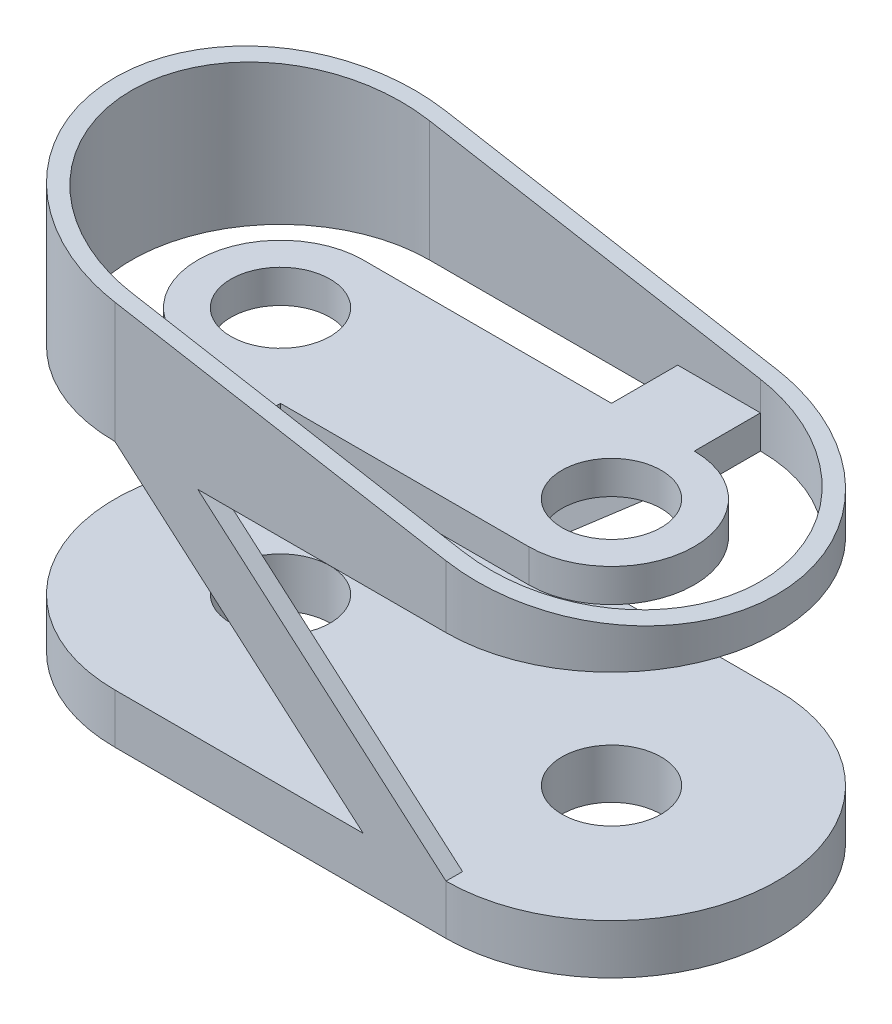
ISO-10303-21;
HEADER;
FILE_DESCRIPTION(('STEP AP214'),'2;1');
FILE_NAME('part.step','',(''),(''),'','','');
FILE_SCHEMA(('AUTOMOTIVE_DESIGN { 1 0 10303 214 1 1 1 1 }'));
ENDSEC;
DATA;
#1=APPLICATION_CONTEXT('core data for automotive mechanical design processes');
#2=APPLICATION_PROTOCOL_DEFINITION('international standard','automotive_design',2000,#1);
#3=PRODUCT_CONTEXT('',#1,'mechanical');
#4=PRODUCT('Part','Part','',(#3));
#5=PRODUCT_RELATED_PRODUCT_CATEGORY('part','',(#4));
#6=PRODUCT_DEFINITION_FORMATION('','',#4);
#7=PRODUCT_DEFINITION_CONTEXT('part definition',#1,'design');
#8=PRODUCT_DEFINITION('design','',#6,#7);
#9=PRODUCT_DEFINITION_SHAPE('','',#8);
#10=(LENGTH_UNIT() NAMED_UNIT(*) SI_UNIT(.MILLI.,.METRE.));
#11=(NAMED_UNIT(*) PLANE_ANGLE_UNIT() SI_UNIT($,.RADIAN.));
#12=(NAMED_UNIT(*) SI_UNIT($,.STERADIAN.) SOLID_ANGLE_UNIT());
#13=UNCERTAINTY_MEASURE_WITH_UNIT(LENGTH_MEASURE(1.E-05),#10,'distance_accuracy_value','');
#14=(GEOMETRIC_REPRESENTATION_CONTEXT(3) GLOBAL_UNCERTAINTY_ASSIGNED_CONTEXT((#13)) GLOBAL_UNIT_ASSIGNED_CONTEXT((#10,
#11,#12)) REPRESENTATION_CONTEXT('',''));
#15=CARTESIAN_POINT('',(0.,0.,0.));
#16=DIRECTION('',(0.,0.,1.));
#17=DIRECTION('',(1.,0.,0.));
#18=AXIS2_PLACEMENT_3D('',#15,#16,#17);
#19=CARTESIAN_POINT('',(0.,80.,0.));
#20=DIRECTION('',(0.,1.,0.));
#21=DIRECTION('',(0.,0.,1.));
#22=AXIS2_PLACEMENT_3D('',#19,#20,#21);
#23=PLANE('',#22);
#24=CARTESIAN_POINT('',(49.9999999999998,80.,0.));
#25=DIRECTION('',(0.,1.,0.));
#26=DIRECTION('',(0.,0.,1.));
#27=AXIS2_PLACEMENT_3D('',#24,#25,#26);
#28=CIRCLE('',#27,45.);
#29=CARTESIAN_POINT('',(49.9999999999998,80.,45.));
#30=VERTEX_POINT('',#29);
#31=CARTESIAN_POINT('',(49.9999999999998,80.,-45.));
#32=VERTEX_POINT('',#31);
#33=EDGE_CURVE('E563',#30,#32,#28,.T.);
#34=ORIENTED_EDGE('',*,*,#33,.T.);
#35=DIRECTION('',(0.,0.,1.));
#36=VECTOR('',#35,1.);
#37=CARTESIAN_POINT('',(49.9999999999998,80.,0.));
#38=LINE('',#37,#36);
#39=CARTESIAN_POINT('',(49.9999999999998,80.,-50.));
#40=VERTEX_POINT('',#39);
#41=EDGE_CURVE('E280',#40,#32,#38,.T.);
#42=ORIENTED_EDGE('',*,*,#41,.F.);
#43=CARTESIAN_POINT('',(49.9999999999998,80.,0.));
#44=DIRECTION('',(0.,1.,0.));
#45=DIRECTION('',(0.,0.,1.));
#46=AXIS2_PLACEMENT_3D('',#43,#44,#45);
#47=CIRCLE('',#46,50.);
#48=CARTESIAN_POINT('',(49.9999999999998,80.,50.));
#49=VERTEX_POINT('',#48);
#50=EDGE_CURVE('E323',#40,#49,#47,.F.);
#51=ORIENTED_EDGE('',*,*,#50,.T.);
#52=DIRECTION('',(1.,0.,0.));
#53=VECTOR('',#52,1.);
#54=CARTESIAN_POINT('',(0.,80.,50.));
#55=LINE('',#54,#53);
#56=CARTESIAN_POINT('',(-24.9999999999998,80.,50.));
#57=VERTEX_POINT('',#56);
#58=EDGE_CURVE('E298',#57,#49,#55,.T.);
#59=ORIENTED_EDGE('',*,*,#58,.F.);
#60=DIRECTION('',(0.,0.,1.));
#61=VECTOR('',#60,1.);
#62=CARTESIAN_POINT('',(-24.9999999999998,80.,0.));
#63=LINE('',#62,#61);
#64=CARTESIAN_POINT('',(-24.9999999999998,80.,45.));
#65=VERTEX_POINT('',#64);
#66=EDGE_CURVE('E306',#65,#57,#63,.T.);
#67=ORIENTED_EDGE('',*,*,#66,.F.);
#68=DIRECTION('',(1.,0.,0.));
#69=VECTOR('',#68,1.);
#70=CARTESIAN_POINT('',(0.,80.,45.));
#71=LINE('',#70,#69);
#72=EDGE_CURVE('E335',#65,#30,#71,.T.);
#73=ORIENTED_EDGE('',*,*,#72,.T.);
#74=EDGE_LOOP('',(#34,#42,#51,#59,#67,#73));
#75=FACE_BOUND('',#74,.T.);
#76=ADVANCED_FACE('F99',(#75),#23,.F.);
#77=CARTESIAN_POINT('',(-49.9999999999998,80.,0.));
#78=DIRECTION('',(0.,1.,0.));
#79=DIRECTION('',(0.,0.,1.));
#80=AXIS2_PLACEMENT_3D('',#77,#78,#79);
#81=CIRCLE('',#80,14.9999999999999);
#82=CARTESIAN_POINT('',(-49.9999999999998,80.,14.9999999999999));
#83=VERTEX_POINT('',#82);
#84=EDGE_CURVE('E695',#83,#83,#81,.T.);
#85=ORIENTED_EDGE('',*,*,#84,.T.);
#86=EDGE_LOOP('',(#85));
#87=FACE_BOUND('',#86,.T.);
#88=CARTESIAN_POINT('',(49.9999999999998,80.,0.));
#89=DIRECTION('',(0.,1.,0.));
#90=DIRECTION('',(0.,0.,1.));
#91=AXIS2_PLACEMENT_3D('',#88,#89,#90);
#92=CIRCLE('',#91,15.0000000000002);
#93=CARTESIAN_POINT('',(49.9999999999998,80.,15.0000000000002));
#94=VERTEX_POINT('',#93);
#95=EDGE_CURVE('E690',#94,#94,#92,.T.);
#96=ORIENTED_EDGE('',*,*,#95,.T.);
#97=EDGE_LOOP('',(#96));
#98=FACE_BOUND('',#97,.T.);
#99=DIRECTION('',(0.,0.,1.));
#100=VECTOR('',#99,1.);
#101=CARTESIAN_POINT('',(24.9999999999998,80.,0.));
#102=LINE('',#101,#100);
#103=CARTESIAN_POINT('',(24.9999999999998,80.,-45.));
#104=VERTEX_POINT('',#103);
#105=CARTESIAN_POINT('',(24.9999999999998,80.,-25.));
#106=VERTEX_POINT('',#105);
#107=EDGE_CURVE('E662',#104,#106,#102,.T.);
#108=ORIENTED_EDGE('',*,*,#107,.F.);
#109=DIRECTION('',(-1.,0.,0.));
#110=VECTOR('',#109,1.);
#111=CARTESIAN_POINT('',(0.,80.,-45.));
#112=LINE('',#111,#110);
#113=EDGE_CURVE('E281',#32,#104,#112,.T.);
#114=ORIENTED_EDGE('',*,*,#113,.F.);
#115=DIRECTION('',(0.,0.,1.));
#116=VECTOR('',#115,1.);
#117=CARTESIAN_POINT('',(49.9999999999998,80.,0.));
#118=LINE('',#117,#116);
#119=CARTESIAN_POINT('',(49.9999999999998,80.,-25.));
#120=VERTEX_POINT('',#119);
#121=EDGE_CURVE('E570',#32,#120,#118,.T.);
#122=ORIENTED_EDGE('',*,*,#121,.T.);
#123=CARTESIAN_POINT('',(49.9999999999998,80.,0.));
#124=DIRECTION('',(0.,1.,0.));
#125=DIRECTION('',(0.,0.,1.));
#126=AXIS2_PLACEMENT_3D('',#123,#124,#125);
#127=CIRCLE('',#126,25.);
#128=CARTESIAN_POINT('',(49.9999999999998,80.,25.));
#129=VERTEX_POINT('',#128);
#130=EDGE_CURVE('E666',#129,#120,#127,.T.);
#131=ORIENTED_EDGE('',*,*,#130,.F.);
#132=DIRECTION('',(1.,0.,0.));
#133=VECTOR('',#132,1.);
#134=CARTESIAN_POINT('',(0.,80.,25.));
#135=LINE('',#134,#133);
#136=CARTESIAN_POINT('',(-24.9999999999998,80.,25.));
#137=VERTEX_POINT('',#136);
#138=EDGE_CURVE('E668',#137,#129,#135,.T.);
#139=ORIENTED_EDGE('',*,*,#138,.F.);
#140=DIRECTION('',(0.,0.,1.));
#141=VECTOR('',#140,1.);
#142=CARTESIAN_POINT('',(-24.9999999999998,80.,0.));
#143=LINE('',#142,#141);
#144=EDGE_CURVE('E739',#137,#65,#143,.T.);
#145=ORIENTED_EDGE('',*,*,#144,.T.);
#146=DIRECTION('',(1.,0.,0.));
#147=VECTOR('',#146,1.);
#148=CARTESIAN_POINT('',(0.,80.,45.));
#149=LINE('',#148,#147);
#150=CARTESIAN_POINT('',(-49.9999999999998,80.,45.));
#151=VERTEX_POINT('',#150);
#152=EDGE_CURVE('E387',#151,#65,#149,.T.);
#153=ORIENTED_EDGE('',*,*,#152,.F.);
#154=DIRECTION('',(0.,0.,1.));
#155=VECTOR('',#154,1.);
#156=CARTESIAN_POINT('',(-49.9999999999998,80.,0.));
#157=LINE('',#156,#155);
#158=CARTESIAN_POINT('',(-49.9999999999998,80.,25.));
#159=VERTEX_POINT('',#158);
#160=EDGE_CURVE('E686',#159,#151,#157,.T.);
#161=ORIENTED_EDGE('',*,*,#160,.F.);
#162=CARTESIAN_POINT('',(-49.9999999999998,80.,0.));
#163=DIRECTION('',(0.,1.,0.));
#164=DIRECTION('',(0.,0.,1.));
#165=AXIS2_PLACEMENT_3D('',#162,#163,#164);
#166=CIRCLE('',#165,25.);
#167=CARTESIAN_POINT('',(-49.9999999999998,80.,-25.));
#168=VERTEX_POINT('',#167);
#169=EDGE_CURVE('E681',#168,#159,#166,.T.);
#170=ORIENTED_EDGE('',*,*,#169,.F.);
#171=DIRECTION('',(1.,0.,0.));
#172=VECTOR('',#171,1.);
#173=CARTESIAN_POINT('',(0.,80.,-25.));
#174=LINE('',#173,#172);
#175=EDGE_CURVE('E318',#168,#106,#174,.T.);
#176=ORIENTED_EDGE('',*,*,#175,.T.);
#177=EDGE_LOOP('',(#108,#114,#122,#131,#139,#145,#153,#161,#170,#176));
#178=FACE_BOUND('',#177,.T.);
#179=ADVANCED_FACE('F348',(#87,#98,#178),#23,.F.);
#180=CARTESIAN_POINT('',(50.,15.,0.));
#181=DIRECTION('',(0.,-1.,0.));
#182=DIRECTION('',(0.,0.,-1.));
#183=AXIS2_PLACEMENT_3D('',#180,#181,#182);
#184=PLANE('',#183);
#185=DIRECTION('',(1.,0.,0.));
#186=VECTOR('',#185,1.);
#187=CARTESIAN_POINT('',(0.,15.,-45.));
#188=LINE('',#187,#186);
#189=CARTESIAN_POINT('',(-50.,15.,-45.));
#190=VERTEX_POINT('',#189);
#191=CARTESIAN_POINT('',(-25.,15.,-45.));
#192=VERTEX_POINT('',#191);
#193=EDGE_CURVE('E502',#190,#192,#188,.T.);
#194=ORIENTED_EDGE('',*,*,#193,.F.);
#195=DIRECTION('',(0.,0.,1.));
#196=VECTOR('',#195,1.);
#197=CARTESIAN_POINT('',(-50.0000000000001,15.,0.));
#198=LINE('',#197,#196);
#199=CARTESIAN_POINT('',(-50.,15.,-50.));
#200=VERTEX_POINT('',#199);
#201=EDGE_CURVE('E497',#200,#190,#198,.T.);
#202=ORIENTED_EDGE('',*,*,#201,.F.);
#203=CARTESIAN_POINT('',(-50.,15.,0.));
#204=DIRECTION('',(0.,1.,0.));
#205=DIRECTION('',(0.,0.,1.));
#206=AXIS2_PLACEMENT_3D('',#203,#204,#205);
#207=CIRCLE('',#206,50.);
#208=CARTESIAN_POINT('',(-50.,15.,50.));
#209=VERTEX_POINT('',#208);
#210=EDGE_CURVE('E464',#200,#209,#207,.T.);
#211=ORIENTED_EDGE('',*,*,#210,.T.);
#212=DIRECTION('',(1.,0.,0.));
#213=VECTOR('',#212,1.);
#214=CARTESIAN_POINT('',(-50.,15.,50.));
#215=LINE('',#214,#213);
#216=CARTESIAN_POINT('',(25.,15.,50.));
#217=VERTEX_POINT('',#216);
#218=EDGE_CURVE('E461',#209,#217,#215,.T.);
#219=ORIENTED_EDGE('',*,*,#218,.T.);
#220=DIRECTION('',(0.,0.,1.));
#221=VECTOR('',#220,1.);
#222=CARTESIAN_POINT('',(25.,15.,0.));
#223=LINE('',#222,#221);
#224=CARTESIAN_POINT('',(25.,15.,45.));
#225=VERTEX_POINT('',#224);
#226=EDGE_CURVE('E439',#225,#217,#223,.T.);
#227=ORIENTED_EDGE('',*,*,#226,.F.);
#228=DIRECTION('',(-1.,0.,0.));
#229=VECTOR('',#228,1.);
#230=CARTESIAN_POINT('',(0.,15.,45.));
#231=LINE('',#230,#229);
#232=CARTESIAN_POINT('',(50.,15.,45.));
#233=VERTEX_POINT('',#232);
#234=EDGE_CURVE('E441',#233,#225,#231,.T.);
#235=ORIENTED_EDGE('',*,*,#234,.F.);
#236=DIRECTION('',(-1.02695629777827E-13,0.,-1.));
#237=VECTOR('',#236,1.);
#238=CARTESIAN_POINT('',(49.9999999999954,15.,-5.13478148889088E-12));
#239=LINE('',#238,#237);
#240=CARTESIAN_POINT('',(50.,15.,50.));
#241=VERTEX_POINT('',#240);
#242=EDGE_CURVE('E378',#241,#233,#239,.T.);
#243=ORIENTED_EDGE('',*,*,#242,.F.);
#244=CARTESIAN_POINT('',(50.,15.,0.));
#245=DIRECTION('',(0.,1.,0.));
#246=DIRECTION('',(0.,0.,-1.));
#247=AXIS2_PLACEMENT_3D('',#244,#245,#246);
#248=CIRCLE('',#247,50.);
#249=CARTESIAN_POINT('',(50.,15.,-50.));
#250=VERTEX_POINT('',#249);
#251=EDGE_CURVE('E451',#241,#250,#248,.T.);
#252=ORIENTED_EDGE('',*,*,#251,.T.);
#253=DIRECTION('',(-1.,0.,0.));
#254=VECTOR('',#253,1.);
#255=CARTESIAN_POINT('',(-50.,15.,-50.));
#256=LINE('',#255,#254);
#257=CARTESIAN_POINT('',(-25.,15.,-50.));
#258=VERTEX_POINT('',#257);
#259=EDGE_CURVE('E453',#250,#258,#256,.T.);
#260=ORIENTED_EDGE('',*,*,#259,.T.);
#261=DIRECTION('',(0.,0.,-1.));
#262=VECTOR('',#261,1.);
#263=CARTESIAN_POINT('',(-25.,15.,0.));
#264=LINE('',#263,#262);
#265=EDGE_CURVE('E501',#192,#258,#264,.T.);
#266=ORIENTED_EDGE('',*,*,#265,.F.);
#267=EDGE_LOOP('',(#194,#202,#211,#219,#227,#235,#243,#252,#260,#266));
#268=FACE_BOUND('',#267,.T.);
#269=CARTESIAN_POINT('',(50.,15.,0.));
#270=DIRECTION('',(0.,1.,0.));
#271=DIRECTION('',(0.,0.,1.));
#272=AXIS2_PLACEMENT_3D('',#269,#270,#271);
#273=CIRCLE('',#272,15.);
#274=CARTESIAN_POINT('',(50.,15.,15.));
#275=VERTEX_POINT('',#274);
#276=EDGE_CURVE('E474',#275,#275,#273,.T.);
#277=ORIENTED_EDGE('',*,*,#276,.F.);
#278=EDGE_LOOP('',(#277));
#279=FACE_BOUND('',#278,.T.);
#280=CARTESIAN_POINT('',(-50.,15.,0.));
#281=DIRECTION('',(0.,1.,0.));
#282=DIRECTION('',(0.,0.,1.));
#283=AXIS2_PLACEMENT_3D('',#280,#281,#282);
#284=CIRCLE('',#283,15.);
#285=CARTESIAN_POINT('',(-50.,15.,15.));
#286=VERTEX_POINT('',#285);
#287=EDGE_CURVE('E1126',#286,#286,#284,.T.);
#288=ORIENTED_EDGE('',*,*,#287,.F.);
#289=EDGE_LOOP('',(#288));
#290=FACE_BOUND('',#289,.T.);
#291=ADVANCED_FACE('F560',(#268,#279,#290),#184,.F.);
#292=CARTESIAN_POINT('',(50.,0.,0.));
#293=DIRECTION('',(0.,-1.,0.));
#294=DIRECTION('',(0.,0.,-1.));
#295=AXIS2_PLACEMENT_3D('',#292,#293,#294);
#296=PLANE('',#295);
#297=CARTESIAN_POINT('',(50.,0.,0.));
#298=DIRECTION('',(0.,1.,0.));
#299=DIRECTION('',(0.,0.,1.));
#300=AXIS2_PLACEMENT_3D('',#297,#298,#299);
#301=CIRCLE('',#300,15.);
#302=CARTESIAN_POINT('',(50.,0.,15.));
#303=VERTEX_POINT('',#302);
#304=EDGE_CURVE('E1130',#303,#303,#301,.T.);
#305=ORIENTED_EDGE('',*,*,#304,.T.);
#306=EDGE_LOOP('',(#305));
#307=FACE_BOUND('',#306,.T.);
#308=CARTESIAN_POINT('',(50.,0.,0.));
#309=DIRECTION('',(0.,1.,0.));
#310=DIRECTION('',(0.,0.,-1.));
#311=AXIS2_PLACEMENT_3D('',#308,#309,#310);
#312=CIRCLE('',#311,50.);
#313=CARTESIAN_POINT('',(50.,0.,50.));
#314=VERTEX_POINT('',#313);
#315=CARTESIAN_POINT('',(50.,0.,-50.));
#316=VERTEX_POINT('',#315);
#317=EDGE_CURVE('E471',#314,#316,#312,.T.);
#318=ORIENTED_EDGE('',*,*,#317,.F.);
#319=DIRECTION('',(1.,0.,0.));
#320=VECTOR('',#319,1.);
#321=CARTESIAN_POINT('',(-50.,0.,50.));
#322=LINE('',#321,#320);
#323=CARTESIAN_POINT('',(-50.,0.,50.));
#324=VERTEX_POINT('',#323);
#325=EDGE_CURVE('E454',#324,#314,#322,.T.);
#326=ORIENTED_EDGE('',*,*,#325,.F.);
#327=CARTESIAN_POINT('',(-50.,0.,0.));
#328=DIRECTION('',(0.,1.,0.));
#329=DIRECTION('',(0.,0.,1.));
#330=AXIS2_PLACEMENT_3D('',#327,#328,#329);
#331=CIRCLE('',#330,50.);
#332=CARTESIAN_POINT('',(-50.,0.,-50.));
#333=VERTEX_POINT('',#332);
#334=EDGE_CURVE('E476',#333,#324,#331,.T.);
#335=ORIENTED_EDGE('',*,*,#334,.F.);
#336=DIRECTION('',(-1.,0.,0.));
#337=VECTOR('',#336,1.);
#338=CARTESIAN_POINT('',(-50.,0.,-50.));
#339=LINE('',#338,#337);
#340=EDGE_CURVE('E473',#316,#333,#339,.T.);
#341=ORIENTED_EDGE('',*,*,#340,.F.);
#342=EDGE_LOOP('',(#318,#326,#335,#341));
#343=FACE_BOUND('',#342,.T.);
#344=CARTESIAN_POINT('',(-50.,0.,0.));
#345=DIRECTION('',(0.,1.,0.));
#346=DIRECTION('',(0.,0.,1.));
#347=AXIS2_PLACEMENT_3D('',#344,#345,#346);
#348=CIRCLE('',#347,15.);
#349=CARTESIAN_POINT('',(-50.,0.,15.));
#350=VERTEX_POINT('',#349);
#351=EDGE_CURVE('E432',#350,#350,#348,.T.);
#352=ORIENTED_EDGE('',*,*,#351,.T.);
#353=EDGE_LOOP('',(#352));
#354=FACE_BOUND('',#353,.T.);
#355=ADVANCED_FACE('F620',(#307,#343,#354),#296,.T.);
#356=CARTESIAN_POINT('',(50.,15.,0.));
#357=DIRECTION('',(0.,-1.,0.));
#358=DIRECTION('',(0.,0.,-1.));
#359=AXIS2_PLACEMENT_3D('',#356,#357,#358);
#360=CYLINDRICAL_SURFACE('',#359,50.);
#361=DIRECTION('',(0.,-1.,0.));
#362=VECTOR('',#361,1.);
#363=CARTESIAN_POINT('',(50.,15.,-50.));
#364=LINE('',#363,#362);
#365=EDGE_CURVE('E13',#250,#316,#364,.T.);
#366=ORIENTED_EDGE('',*,*,#365,.F.);
#367=ORIENTED_EDGE('',*,*,#251,.F.);
#368=DIRECTION('',(0.,-1.,0.));
#369=VECTOR('',#368,1.);
#370=CARTESIAN_POINT('',(50.,15.,50.));
#371=LINE('',#370,#369);
#372=EDGE_CURVE('E457',#241,#314,#371,.T.);
#373=ORIENTED_EDGE('',*,*,#372,.T.);
#374=ORIENTED_EDGE('',*,*,#317,.T.);
#375=EDGE_LOOP('',(#366,#367,#373,#374));
#376=FACE_BOUND('',#375,.T.);
#377=ADVANCED_FACE('F101',(#376),#360,.T.);
#378=CARTESIAN_POINT('',(-50.,15.,-50.));
#379=DIRECTION('',(0.,0.,1.));
#380=DIRECTION('',(1.,0.,0.));
#381=AXIS2_PLACEMENT_3D('',#378,#379,#380);
#382=PLANE('',#381);
#383=ORIENTED_EDGE('',*,*,#340,.T.);
#384=DIRECTION('',(0.,-1.,0.));
#385=VECTOR('',#384,1.);
#386=CARTESIAN_POINT('',(-50.,15.,-50.));
#387=LINE('',#386,#385);
#388=EDGE_CURVE('E108',#200,#333,#387,.T.);
#389=ORIENTED_EDGE('',*,*,#388,.F.);
#390=DIRECTION('',(-0.755689082789817,-0.654930538417843,0.));
#391=VECTOR('',#390,1.);
#392=CARTESIAN_POINT('',(24.9999999999998,80.,-50.));
#393=LINE('',#392,#391);
#394=CARTESIAN_POINT('',(24.9999999999998,80.,-50.));
#395=VERTEX_POINT('',#394);
#396=EDGE_CURVE('E272',#395,#200,#393,.T.);
#397=ORIENTED_EDGE('',*,*,#396,.F.);
#398=DIRECTION('',(1.,0.,0.));
#399=VECTOR('',#398,1.);
#400=CARTESIAN_POINT('',(0.,80.,-50.));
#401=LINE('',#400,#399);
#402=CARTESIAN_POINT('',(-49.9999999999998,80.,-50.));
#403=VERTEX_POINT('',#402);
#404=EDGE_CURVE('E287',#403,#395,#401,.T.);
#405=ORIENTED_EDGE('',*,*,#404,.F.);
#406=DIRECTION('',(0.,1.,0.));
#407=VECTOR('',#406,1.);
#408=CARTESIAN_POINT('',(-49.9999999999998,80.,-50.));
#409=LINE('',#408,#407);
#410=CARTESIAN_POINT('',(-49.9999999999998,116.44904710627,-50.));
#411=VERTEX_POINT('',#410);
#412=EDGE_CURVE('E371',#403,#411,#409,.T.);
#413=ORIENTED_EDGE('',*,*,#412,.T.);
#414=DIRECTION('',(-0.984807753012208,0.173648177666931,0.));
#415=VECTOR('',#414,1.);
#416=CARTESIAN_POINT('',(100.,90.,-50.));
#417=LINE('',#416,#415);
#418=CARTESIAN_POINT('',(49.9999999999998,98.8163490354233,-50.));
#419=VERTEX_POINT('',#418);
#420=EDGE_CURVE('E790',#419,#411,#417,.T.);
#421=ORIENTED_EDGE('',*,*,#420,.F.);
#422=DIRECTION('',(0.,1.,0.));
#423=VECTOR('',#422,1.);
#424=CARTESIAN_POINT('',(49.9999999999998,80.,-50.));
#425=LINE('',#424,#423);
#426=EDGE_CURVE('E598',#40,#419,#425,.T.);
#427=ORIENTED_EDGE('',*,*,#426,.F.);
#428=DIRECTION('',(-0.755689082789817,-0.654930538417843,0.));
#429=VECTOR('',#428,1.);
#430=CARTESIAN_POINT('',(49.9999999999998,80.,-50.));
#431=LINE('',#430,#429);
#432=EDGE_CURVE('E291',#40,#258,#431,.T.);
#433=ORIENTED_EDGE('',*,*,#432,.T.);
#434=ORIENTED_EDGE('',*,*,#259,.F.);
#435=ORIENTED_EDGE('',*,*,#365,.T.);
#436=EDGE_LOOP('',(#383,#389,#397,#405,#413,#421,#427,#433,#434,#435));
#437=FACE_BOUND('',#436,.T.);
#438=ADVANCED_FACE('F285',(#437),#382,.F.);
#439=CARTESIAN_POINT('',(-50.,15.,0.));
#440=DIRECTION('',(0.,-1.,0.));
#441=DIRECTION('',(0.,0.,-1.));
#442=AXIS2_PLACEMENT_3D('',#439,#440,#441);
#443=CYLINDRICAL_SURFACE('',#442,50.);
#444=DIRECTION('',(0.,-1.,0.));
#445=VECTOR('',#444,1.);
#446=CARTESIAN_POINT('',(-50.,15.,50.));
#447=LINE('',#446,#445);
#448=EDGE_CURVE('E460',#209,#324,#447,.T.);
#449=ORIENTED_EDGE('',*,*,#448,.F.);
#450=ORIENTED_EDGE('',*,*,#210,.F.);
#451=ORIENTED_EDGE('',*,*,#388,.T.);
#452=ORIENTED_EDGE('',*,*,#334,.T.);
#453=EDGE_LOOP('',(#449,#450,#451,#452));
#454=FACE_BOUND('',#453,.T.);
#455=ADVANCED_FACE('F629',(#454),#443,.T.);
#456=CARTESIAN_POINT('',(-50.,15.,50.));
#457=DIRECTION('',(0.,0.,-1.));
#458=DIRECTION('',(-1.,0.,0.));
#459=AXIS2_PLACEMENT_3D('',#456,#457,#458);
#460=PLANE('',#459);
#461=ORIENTED_EDGE('',*,*,#325,.T.);
#462=ORIENTED_EDGE('',*,*,#372,.F.);
#463=DIRECTION('',(-0.755689082789817,0.654930538417843,0.));
#464=VECTOR('',#463,1.);
#465=CARTESIAN_POINT('',(50.,15.,50.));
#466=LINE('',#465,#464);
#467=EDGE_CURVE('E374',#241,#57,#466,.T.);
#468=ORIENTED_EDGE('',*,*,#467,.T.);
#469=ORIENTED_EDGE('',*,*,#58,.T.);
#470=DIRECTION('',(0.,1.,0.));
#471=VECTOR('',#470,1.);
#472=CARTESIAN_POINT('',(49.9999999999998,80.,50.));
#473=LINE('',#472,#471);
#474=CARTESIAN_POINT('',(49.9999999999998,98.8163490354233,50.));
#475=VERTEX_POINT('',#474);
#476=EDGE_CURVE('E370',#49,#475,#473,.T.);
#477=ORIENTED_EDGE('',*,*,#476,.T.);
#478=DIRECTION('',(-0.984807753012208,0.173648177666931,0.));
#479=VECTOR('',#478,1.);
#480=CARTESIAN_POINT('',(100.,90.,50.));
#481=LINE('',#480,#479);
#482=CARTESIAN_POINT('',(-49.9999999999998,116.44904710627,50.));
#483=VERTEX_POINT('',#482);
#484=EDGE_CURVE('E500',#475,#483,#481,.T.);
#485=ORIENTED_EDGE('',*,*,#484,.T.);
#486=DIRECTION('',(0.,1.,0.));
#487=VECTOR('',#486,1.);
#488=CARTESIAN_POINT('',(-49.9999999999998,80.,50.));
#489=LINE('',#488,#487);
#490=CARTESIAN_POINT('',(-49.9999999999998,80.,50.));
#491=VERTEX_POINT('',#490);
#492=EDGE_CURVE('E367',#491,#483,#489,.T.);
#493=ORIENTED_EDGE('',*,*,#492,.F.);
#494=DIRECTION('',(-0.755689082789817,0.654930538417843,0.));
#495=VECTOR('',#494,1.);
#496=CARTESIAN_POINT('',(25.,15.,50.));
#497=LINE('',#496,#495);
#498=EDGE_CURVE('E377',#217,#491,#497,.T.);
#499=ORIENTED_EDGE('',*,*,#498,.F.);
#500=ORIENTED_EDGE('',*,*,#218,.F.);
#501=ORIENTED_EDGE('',*,*,#448,.T.);
#502=EDGE_LOOP('',(#461,#462,#468,#469,#477,#485,#493,#499,#500,#501));
#503=FACE_BOUND('',#502,.T.);
#504=ADVANCED_FACE('F626',(#503),#460,.F.);
#505=CARTESIAN_POINT('',(50.,15.,0.));
#506=DIRECTION('',(0.,-1.,0.));
#507=DIRECTION('',(0.,0.,-1.));
#508=AXIS2_PLACEMENT_3D('',#505,#506,#507);
#509=CYLINDRICAL_SURFACE('',#508,15.);
#510=ORIENTED_EDGE('',*,*,#276,.T.);
#511=EDGE_LOOP('',(#510));
#512=FACE_BOUND('',#511,.T.);
#513=ORIENTED_EDGE('',*,*,#304,.F.);
#514=EDGE_LOOP('',(#513));
#515=FACE_BOUND('',#514,.T.);
#516=ADVANCED_FACE('F621',(#512,#515),#509,.F.);
#517=CARTESIAN_POINT('',(-50.,15.,0.));
#518=DIRECTION('',(0.,-1.,0.));
#519=DIRECTION('',(0.,0.,-1.));
#520=AXIS2_PLACEMENT_3D('',#517,#518,#519);
#521=CYLINDRICAL_SURFACE('',#520,15.);
#522=ORIENTED_EDGE('',*,*,#287,.T.);
#523=EDGE_LOOP('',(#522));
#524=FACE_BOUND('',#523,.T.);
#525=ORIENTED_EDGE('',*,*,#351,.F.);
#526=EDGE_LOOP('',(#525));
#527=FACE_BOUND('',#526,.T.);
#528=ADVANCED_FACE('F412',(#524,#527),#521,.F.);
#529=CARTESIAN_POINT('',(18.1472081218275,20.9390862944162,0.));
#530=DIRECTION('',(-0.654930538417843,-0.755689082789817,0.));
#531=DIRECTION('',(0.755689082789817,-0.654930538417843,0.));
#532=AXIS2_PLACEMENT_3D('',#529,#530,#531);
#533=PLANE('',#532);
#534=ORIENTED_EDGE('',*,*,#498,.T.);
#535=DIRECTION('',(0.,0.,-1.));
#536=VECTOR('',#535,1.);
#537=CARTESIAN_POINT('',(-49.9999999999998,80.,0.));
#538=LINE('',#537,#536);
#539=EDGE_CURVE('E395',#491,#151,#538,.T.);
#540=ORIENTED_EDGE('',*,*,#539,.T.);
#541=DIRECTION('',(-0.755689082789817,0.654930538417843,0.));
#542=VECTOR('',#541,1.);
#543=CARTESIAN_POINT('',(25.,15.,45.));
#544=LINE('',#543,#542);
#545=EDGE_CURVE('E124',#225,#151,#544,.T.);
#546=ORIENTED_EDGE('',*,*,#545,.F.);
#547=ORIENTED_EDGE('',*,*,#226,.T.);
#548=EDGE_LOOP('',(#534,#540,#546,#547));
#549=FACE_BOUND('',#548,.T.);
#550=ADVANCED_FACE('F401',(#549),#533,.T.);
#551=CARTESIAN_POINT('',(28.8705583756346,33.3121827411168,0.));
#552=DIRECTION('',(0.654930538417843,0.755689082789817,0.));
#553=DIRECTION('',(-0.755689082789817,0.654930538417843,0.));
#554=AXIS2_PLACEMENT_3D('',#551,#552,#553);
#555=PLANE('',#554);
#556=DIRECTION('',(-0.755689082789817,0.654930538417843,0.));
#557=VECTOR('',#556,1.);
#558=CARTESIAN_POINT('',(50.,15.,45.));
#559=LINE('',#558,#557);
#560=EDGE_CURVE('E381',#233,#65,#559,.T.);
#561=ORIENTED_EDGE('',*,*,#560,.T.);
#562=ORIENTED_EDGE('',*,*,#66,.T.);
#563=ORIENTED_EDGE('',*,*,#467,.F.);
#564=ORIENTED_EDGE('',*,*,#242,.T.);
#565=EDGE_LOOP('',(#561,#562,#563,#564));
#566=FACE_BOUND('',#565,.T.);
#567=ADVANCED_FACE('F411',(#566),#555,.T.);
#568=CARTESIAN_POINT('',(0.,0.,45.));
#569=DIRECTION('',(0.,0.,-1.));
#570=DIRECTION('',(0.,1.,0.));
#571=AXIS2_PLACEMENT_3D('',#568,#569,#570);
#572=PLANE('',#571);
#573=ORIENTED_EDGE('',*,*,#545,.T.);
#574=ORIENTED_EDGE('',*,*,#152,.T.);
#575=ORIENTED_EDGE('',*,*,#560,.F.);
#576=ORIENTED_EDGE('',*,*,#234,.T.);
#577=EDGE_LOOP('',(#573,#574,#575,#576));
#578=FACE_BOUND('',#577,.T.);
#579=ADVANCED_FACE('F347',(#578),#572,.T.);
#580=ORIENTED_EDGE('',*,*,#404,.T.);
#581=DIRECTION('',(0.,0.,-1.));
#582=VECTOR('',#581,1.);
#583=CARTESIAN_POINT('',(25.,80.,0.));
#584=LINE('',#583,#582);
#585=EDGE_CURVE('E268',#104,#395,#584,.T.);
#586=ORIENTED_EDGE('',*,*,#585,.F.);
#587=DIRECTION('',(1.,0.,0.));
#588=VECTOR('',#587,1.);
#589=CARTESIAN_POINT('',(0.,80.,-45.));
#590=LINE('',#589,#588);
#591=CARTESIAN_POINT('',(-49.9999999999998,80.,-45.));
#592=VERTEX_POINT('',#591);
#593=EDGE_CURVE('E675',#592,#104,#590,.T.);
#594=ORIENTED_EDGE('',*,*,#593,.F.);
#595=CARTESIAN_POINT('',(-49.9999999999998,80.,0.));
#596=DIRECTION('',(0.,1.,0.));
#597=DIRECTION('',(0.,0.,1.));
#598=AXIS2_PLACEMENT_3D('',#595,#596,#597);
#599=CIRCLE('',#598,45.);
#600=EDGE_CURVE('E595',#592,#151,#599,.T.);
#601=ORIENTED_EDGE('',*,*,#600,.T.);
#602=ORIENTED_EDGE('',*,*,#539,.F.);
#603=CARTESIAN_POINT('',(-49.9999999999998,80.,0.));
#604=DIRECTION('',(0.,1.,0.));
#605=DIRECTION('',(0.,0.,1.));
#606=AXIS2_PLACEMENT_3D('',#603,#604,#605);
#607=CIRCLE('',#606,50.);
#608=EDGE_CURVE('E295',#403,#491,#607,.T.);
#609=ORIENTED_EDGE('',*,*,#608,.F.);
#610=EDGE_LOOP('',(#580,#586,#594,#601,#602,#609));
#611=FACE_BOUND('',#610,.T.);
#612=ADVANCED_FACE('F293',(#611),#23,.F.);
#613=CARTESIAN_POINT('',(0.,80.,45.));
#614=DIRECTION('',(0.,0.,1.));
#615=DIRECTION('',(1.,0.,0.));
#616=AXIS2_PLACEMENT_3D('',#613,#614,#615);
#617=PLANE('',#616);
#618=DIRECTION('',(-0.984807753012208,0.173648177666931,0.));
#619=VECTOR('',#618,1.);
#620=CARTESIAN_POINT('',(4.72546967733294,106.799470270213,45.));
#621=LINE('',#620,#619);
#622=CARTESIAN_POINT('',(49.9999999999998,98.8163490354233,45.));
#623=VERTEX_POINT('',#622);
#624=CARTESIAN_POINT('',(-49.9999999999998,116.44904710627,45.));
#625=VERTEX_POINT('',#624);
#626=EDGE_CURVE('E779',#623,#625,#621,.T.);
#627=ORIENTED_EDGE('',*,*,#626,.F.);
#628=DIRECTION('',(0.,1.,0.));
#629=VECTOR('',#628,1.);
#630=CARTESIAN_POINT('',(49.9999999999998,80.,45.));
#631=LINE('',#630,#629);
#632=EDGE_CURVE('E582',#30,#623,#631,.T.);
#633=ORIENTED_EDGE('',*,*,#632,.F.);
#634=ORIENTED_EDGE('',*,*,#72,.F.);
#635=DIRECTION('',(0.,1.,0.));
#636=VECTOR('',#635,1.);
#637=CARTESIAN_POINT('',(-24.9999999999998,80.,45.));
#638=LINE('',#637,#636);
#639=CARTESIAN_POINT('',(-24.9999999999998,90.,45.));
#640=VERTEX_POINT('',#639);
#641=EDGE_CURVE('E585',#65,#640,#638,.T.);
#642=ORIENTED_EDGE('',*,*,#641,.T.);
#643=DIRECTION('',(1.,0.,0.));
#644=VECTOR('',#643,1.);
#645=CARTESIAN_POINT('',(0.,90.,45.));
#646=LINE('',#645,#644);
#647=CARTESIAN_POINT('',(-49.9999999999998,90.,45.));
#648=VERTEX_POINT('',#647);
#649=EDGE_CURVE('E771',#648,#640,#646,.T.);
#650=ORIENTED_EDGE('',*,*,#649,.F.);
#651=DIRECTION('',(0.,-1.,0.));
#652=VECTOR('',#651,1.);
#653=CARTESIAN_POINT('',(-49.9999999999998,130.,45.));
#654=LINE('',#653,#652);
#655=EDGE_CURVE('E314',#625,#648,#654,.T.);
#656=ORIENTED_EDGE('',*,*,#655,.F.);
#657=EDGE_LOOP('',(#627,#633,#634,#642,#650,#656));
#658=FACE_BOUND('',#657,.T.);
#659=ADVANCED_FACE('F346',(#658),#617,.F.);
#660=CARTESIAN_POINT('',(49.9999999999998,80.,0.));
#661=DIRECTION('',(0.,1.,0.));
#662=DIRECTION('',(0.,0.,1.));
#663=AXIS2_PLACEMENT_3D('',#660,#661,#662);
#664=CYLINDRICAL_SURFACE('',#663,45.);
#665=CARTESIAN_POINT('',(49.9999999999998,98.8163490354233,0.));
#666=DIRECTION('',(0.173648177666931,0.984807753012208,0.));
#667=DIRECTION('',(-0.984807753012208,0.173648177666931,0.));
#668=AXIS2_PLACEMENT_3D('',#665,#666,#667);
#669=ELLIPSE('',#668,45.6941975348585,45.);
#670=CARTESIAN_POINT('',(49.9999999999998,98.8163490354233,-45.));
#671=VERTEX_POINT('',#670);
#672=EDGE_CURVE('E798',#671,#623,#669,.F.);
#673=ORIENTED_EDGE('',*,*,#672,.F.);
#674=DIRECTION('',(0.,-1.,0.));
#675=VECTOR('',#674,1.);
#676=CARTESIAN_POINT('',(49.9999999999998,130.,-45.));
#677=LINE('',#676,#675);
#678=CARTESIAN_POINT('',(49.9999999999998,90.,-45.));
#679=VERTEX_POINT('',#678);
#680=EDGE_CURVE('E577',#671,#679,#677,.T.);
#681=ORIENTED_EDGE('',*,*,#680,.T.);
#682=DIRECTION('',(0.,1.,0.));
#683=VECTOR('',#682,1.);
#684=CARTESIAN_POINT('',(49.9999999999998,80.,-45.));
#685=LINE('',#684,#683);
#686=EDGE_CURVE('E573',#32,#679,#685,.T.);
#687=ORIENTED_EDGE('',*,*,#686,.F.);
#688=ORIENTED_EDGE('',*,*,#33,.F.);
#689=ORIENTED_EDGE('',*,*,#632,.T.);
#690=EDGE_LOOP('',(#673,#681,#687,#688,#689));
#691=FACE_BOUND('',#690,.T.);
#692=ADVANCED_FACE('F575',(#691),#664,.F.);
#693=CARTESIAN_POINT('',(-49.9999999999998,80.,0.));
#694=DIRECTION('',(0.,1.,0.));
#695=DIRECTION('',(0.,0.,1.));
#696=AXIS2_PLACEMENT_3D('',#693,#694,#695);
#697=CYLINDRICAL_SURFACE('',#696,45.);
#698=CARTESIAN_POINT('',(-49.9999999999998,116.44904710627,0.));
#699=DIRECTION('',(0.173648177666931,0.984807753012208,0.));
#700=DIRECTION('',(-0.984807753012208,0.173648177666931,0.));
#701=AXIS2_PLACEMENT_3D('',#698,#699,#700);
#702=ELLIPSE('',#701,45.6941975348585,45.);
#703=CARTESIAN_POINT('',(-49.9999999999998,116.44904710627,-45.));
#704=VERTEX_POINT('',#703);
#705=EDGE_CURVE('E794',#625,#704,#702,.F.);
#706=ORIENTED_EDGE('',*,*,#705,.F.);
#707=ORIENTED_EDGE('',*,*,#655,.T.);
#708=DIRECTION('',(0.,1.,0.));
#709=VECTOR('',#708,1.);
#710=CARTESIAN_POINT('',(-49.9999999999998,80.,45.));
#711=LINE('',#710,#709);
#712=EDGE_CURVE('E729',#151,#648,#711,.T.);
#713=ORIENTED_EDGE('',*,*,#712,.F.);
#714=ORIENTED_EDGE('',*,*,#600,.F.);
#715=DIRECTION('',(0.,1.,0.));
#716=VECTOR('',#715,1.);
#717=CARTESIAN_POINT('',(-49.9999999999998,80.,-45.));
#718=LINE('',#717,#716);
#719=EDGE_CURVE('E601',#592,#704,#718,.T.);
#720=ORIENTED_EDGE('',*,*,#719,.T.);
#721=EDGE_LOOP('',(#706,#707,#713,#714,#720));
#722=FACE_BOUND('',#721,.T.);
#723=ADVANCED_FACE('F800',(#722),#697,.F.);
#724=CARTESIAN_POINT('',(49.9999999999998,80.,0.));
#725=DIRECTION('',(0.,1.,0.));
#726=DIRECTION('',(0.,0.,1.));
#727=AXIS2_PLACEMENT_3D('',#724,#725,#726);
#728=CYLINDRICAL_SURFACE('',#727,50.);
#729=ORIENTED_EDGE('',*,*,#476,.F.);
#730=ORIENTED_EDGE('',*,*,#50,.F.);
#731=ORIENTED_EDGE('',*,*,#426,.T.);
#732=CARTESIAN_POINT('',(49.9999999999998,98.8163490354233,0.));
#733=DIRECTION('',(0.173648177666931,0.984807753012208,0.));
#734=DIRECTION('',(-0.984807753012208,0.173648177666931,0.));
#735=AXIS2_PLACEMENT_3D('',#732,#733,#734);
#736=ELLIPSE('',#735,50.7713305942873,50.);
#737=EDGE_CURVE('E777',#475,#419,#736,.T.);
#738=ORIENTED_EDGE('',*,*,#737,.F.);
#739=EDGE_LOOP('',(#729,#730,#731,#738));
#740=FACE_BOUND('',#739,.T.);
#741=ADVANCED_FACE('F805',(#740),#728,.T.);
#742=CARTESIAN_POINT('',(0.,80.,-45.));
#743=DIRECTION('',(0.,0.,1.));
#744=DIRECTION('',(1.,0.,0.));
#745=AXIS2_PLACEMENT_3D('',#742,#743,#744);
#746=PLANE('',#745);
#747=ORIENTED_EDGE('',*,*,#680,.F.);
#748=DIRECTION('',(-0.984807753012208,0.173648177666931,0.));
#749=VECTOR('',#748,1.);
#750=CARTESIAN_POINT('',(4.72546967733294,106.799470270213,-45.));
#751=LINE('',#750,#749);
#752=EDGE_CURVE('E792',#671,#704,#751,.T.);
#753=ORIENTED_EDGE('',*,*,#752,.T.);
#754=ORIENTED_EDGE('',*,*,#719,.F.);
#755=ORIENTED_EDGE('',*,*,#593,.T.);
#756=DIRECTION('',(0.,1.,0.));
#757=VECTOR('',#756,1.);
#758=CARTESIAN_POINT('',(24.9999999999998,80.,-45.));
#759=LINE('',#758,#757);
#760=CARTESIAN_POINT('',(24.9999999999998,90.,-45.));
#761=VERTEX_POINT('',#760);
#762=EDGE_CURVE('E309',#104,#761,#759,.T.);
#763=ORIENTED_EDGE('',*,*,#762,.T.);
#764=DIRECTION('',(1.,0.,0.));
#765=VECTOR('',#764,1.);
#766=CARTESIAN_POINT('',(0.,90.,-45.));
#767=LINE('',#766,#765);
#768=EDGE_CURVE('E726',#761,#679,#767,.T.);
#769=ORIENTED_EDGE('',*,*,#768,.T.);
#770=EDGE_LOOP('',(#747,#753,#754,#755,#763,#769));
#771=FACE_BOUND('',#770,.T.);
#772=ADVANCED_FACE('F801',(#771),#746,.T.);
#773=CARTESIAN_POINT('',(-49.9999999999998,80.,0.));
#774=DIRECTION('',(0.,1.,0.));
#775=DIRECTION('',(0.,0.,1.));
#776=AXIS2_PLACEMENT_3D('',#773,#774,#775);
#777=CYLINDRICAL_SURFACE('',#776,50.);
#778=ORIENTED_EDGE('',*,*,#608,.T.);
#779=ORIENTED_EDGE('',*,*,#492,.T.);
#780=CARTESIAN_POINT('',(-49.9999999999998,116.44904710627,0.));
#781=DIRECTION('',(0.173648177666931,0.984807753012208,0.));
#782=DIRECTION('',(-0.984807753012208,0.173648177666931,0.));
#783=AXIS2_PLACEMENT_3D('',#780,#781,#782);
#784=ELLIPSE('',#783,50.7713305942873,50.);
#785=EDGE_CURVE('E324',#483,#411,#784,.F.);
#786=ORIENTED_EDGE('',*,*,#785,.T.);
#787=ORIENTED_EDGE('',*,*,#412,.F.);
#788=EDGE_LOOP('',(#778,#779,#786,#787));
#789=FACE_BOUND('',#788,.T.);
#790=ADVANCED_FACE('F413',(#789),#777,.T.);
#791=CARTESIAN_POINT('',(0.,90.,0.));
#792=DIRECTION('',(0.,1.,0.));
#793=DIRECTION('',(0.,0.,1.));
#794=AXIS2_PLACEMENT_3D('',#791,#792,#793);
#795=PLANE('',#794);
#796=CARTESIAN_POINT('',(-49.9999999999998,90.,0.));
#797=DIRECTION('',(0.,1.,0.));
#798=DIRECTION('',(0.,0.,1.));
#799=AXIS2_PLACEMENT_3D('',#796,#797,#798);
#800=CIRCLE('',#799,14.9999999999999);
#801=CARTESIAN_POINT('',(-49.9999999999998,90.,14.9999999999999));
#802=VERTEX_POINT('',#801);
#803=EDGE_CURVE('E715',#802,#802,#800,.T.);
#804=ORIENTED_EDGE('',*,*,#803,.F.);
#805=EDGE_LOOP('',(#804));
#806=FACE_BOUND('',#805,.T.);
#807=CARTESIAN_POINT('',(49.9999999999998,90.,0.));
#808=DIRECTION('',(0.,1.,0.));
#809=DIRECTION('',(0.,0.,1.));
#810=AXIS2_PLACEMENT_3D('',#807,#808,#809);
#811=CIRCLE('',#810,15.0000000000002);
#812=CARTESIAN_POINT('',(49.9999999999998,90.,15.0000000000002));
#813=VERTEX_POINT('',#812);
#814=EDGE_CURVE('E712',#813,#813,#811,.T.);
#815=ORIENTED_EDGE('',*,*,#814,.F.);
#816=EDGE_LOOP('',(#815));
#817=FACE_BOUND('',#816,.T.);
#818=DIRECTION('',(0.,0.,1.));
#819=VECTOR('',#818,1.);
#820=CARTESIAN_POINT('',(-49.9999999999998,90.,0.));
#821=LINE('',#820,#819);
#822=CARTESIAN_POINT('',(-49.9999999999998,90.,25.));
#823=VERTEX_POINT('',#822);
#824=EDGE_CURVE('E709',#823,#648,#821,.T.);
#825=ORIENTED_EDGE('',*,*,#824,.T.);
#826=ORIENTED_EDGE('',*,*,#649,.T.);
#827=DIRECTION('',(0.,0.,1.));
#828=VECTOR('',#827,1.);
#829=CARTESIAN_POINT('',(-24.9999999999998,90.,0.));
#830=LINE('',#829,#828);
#831=CARTESIAN_POINT('',(-24.9999999999998,90.,25.));
#832=VERTEX_POINT('',#831);
#833=EDGE_CURVE('E296',#832,#640,#830,.T.);
#834=ORIENTED_EDGE('',*,*,#833,.F.);
#835=DIRECTION('',(1.,0.,0.));
#836=VECTOR('',#835,1.);
#837=CARTESIAN_POINT('',(0.,90.,25.));
#838=LINE('',#837,#836);
#839=CARTESIAN_POINT('',(49.9999999999998,90.,25.));
#840=VERTEX_POINT('',#839);
#841=EDGE_CURVE('E718',#832,#840,#838,.T.);
#842=ORIENTED_EDGE('',*,*,#841,.T.);
#843=CARTESIAN_POINT('',(49.9999999999998,90.,0.));
#844=DIRECTION('',(0.,1.,0.));
#845=DIRECTION('',(0.,0.,1.));
#846=AXIS2_PLACEMENT_3D('',#843,#844,#845);
#847=CIRCLE('',#846,25.);
#848=CARTESIAN_POINT('',(49.9999999999998,90.,-25.));
#849=VERTEX_POINT('',#848);
#850=EDGE_CURVE('E721',#840,#849,#847,.T.);
#851=ORIENTED_EDGE('',*,*,#850,.T.);
#852=DIRECTION('',(0.,0.,1.));
#853=VECTOR('',#852,1.);
#854=CARTESIAN_POINT('',(49.9999999999998,90.,0.));
#855=LINE('',#854,#853);
#856=EDGE_CURVE('E301',#679,#849,#855,.T.);
#857=ORIENTED_EDGE('',*,*,#856,.F.);
#858=ORIENTED_EDGE('',*,*,#768,.F.);
#859=DIRECTION('',(0.,0.,1.));
#860=VECTOR('',#859,1.);
#861=CARTESIAN_POINT('',(24.9999999999998,90.,0.));
#862=LINE('',#861,#860);
#863=CARTESIAN_POINT('',(24.9999999999998,90.,-25.));
#864=VERTEX_POINT('',#863);
#865=EDGE_CURVE('E700',#761,#864,#862,.T.);
#866=ORIENTED_EDGE('',*,*,#865,.T.);
#867=DIRECTION('',(1.,0.,0.));
#868=VECTOR('',#867,1.);
#869=CARTESIAN_POINT('',(0.,90.,-25.));
#870=LINE('',#869,#868);
#871=CARTESIAN_POINT('',(-49.9999999999998,90.,-25.));
#872=VERTEX_POINT('',#871);
#873=EDGE_CURVE('E703',#872,#864,#870,.T.);
#874=ORIENTED_EDGE('',*,*,#873,.F.);
#875=CARTESIAN_POINT('',(-49.9999999999998,90.,0.));
#876=DIRECTION('',(0.,1.,0.));
#877=DIRECTION('',(0.,0.,1.));
#878=AXIS2_PLACEMENT_3D('',#875,#876,#877);
#879=CIRCLE('',#878,25.);
#880=EDGE_CURVE('E706',#872,#823,#879,.T.);
#881=ORIENTED_EDGE('',*,*,#880,.T.);
#882=EDGE_LOOP('',(#825,#826,#834,#842,#851,#857,#858,#866,#874,#881));
#883=FACE_BOUND('',#882,.T.);
#884=ADVANCED_FACE('F351',(#806,#817,#883),#795,.T.);
#885=CARTESIAN_POINT('',(0.,80.,25.));
#886=DIRECTION('',(0.,0.,1.));
#887=DIRECTION('',(1.,0.,0.));
#888=AXIS2_PLACEMENT_3D('',#885,#886,#887);
#889=PLANE('',#888);
#890=ORIENTED_EDGE('',*,*,#841,.F.);
#891=DIRECTION('',(0.,1.,0.));
#892=VECTOR('',#891,1.);
#893=CARTESIAN_POINT('',(-24.9999999999998,80.,25.));
#894=LINE('',#893,#892);
#895=EDGE_CURVE('E725',#137,#832,#894,.T.);
#896=ORIENTED_EDGE('',*,*,#895,.F.);
#897=ORIENTED_EDGE('',*,*,#138,.T.);
#898=DIRECTION('',(0.,1.,0.));
#899=VECTOR('',#898,1.);
#900=CARTESIAN_POINT('',(49.9999999999998,80.,25.));
#901=LINE('',#900,#899);
#902=EDGE_CURVE('E587',#129,#840,#901,.T.);
#903=ORIENTED_EDGE('',*,*,#902,.T.);
#904=EDGE_LOOP('',(#890,#896,#897,#903));
#905=FACE_BOUND('',#904,.T.);
#906=ADVANCED_FACE('F858',(#905),#889,.T.);
#907=CARTESIAN_POINT('',(-24.9999999999998,80.,0.));
#908=DIRECTION('',(-1.,0.,0.));
#909=DIRECTION('',(0.,0.,1.));
#910=AXIS2_PLACEMENT_3D('',#907,#908,#909);
#911=PLANE('',#910);
#912=ORIENTED_EDGE('',*,*,#833,.T.);
#913=ORIENTED_EDGE('',*,*,#641,.F.);
#914=ORIENTED_EDGE('',*,*,#144,.F.);
#915=ORIENTED_EDGE('',*,*,#895,.T.);
#916=EDGE_LOOP('',(#912,#913,#914,#915));
#917=FACE_BOUND('',#916,.T.);
#918=ADVANCED_FACE('F865',(#917),#911,.F.);
#919=CARTESIAN_POINT('',(49.9999999999998,80.,0.));
#920=DIRECTION('',(-1.,0.,0.));
#921=DIRECTION('',(0.,0.,1.));
#922=AXIS2_PLACEMENT_3D('',#919,#920,#921);
#923=PLANE('',#922);
#924=ORIENTED_EDGE('',*,*,#856,.T.);
#925=DIRECTION('',(0.,1.,0.));
#926=VECTOR('',#925,1.);
#927=CARTESIAN_POINT('',(49.9999999999998,80.,-25.));
#928=LINE('',#927,#926);
#929=EDGE_CURVE('E583',#120,#849,#928,.T.);
#930=ORIENTED_EDGE('',*,*,#929,.F.);
#931=ORIENTED_EDGE('',*,*,#121,.F.);
#932=ORIENTED_EDGE('',*,*,#686,.T.);
#933=EDGE_LOOP('',(#924,#930,#931,#932));
#934=FACE_BOUND('',#933,.T.);
#935=ADVANCED_FACE('F664',(#934),#923,.F.);
#936=CARTESIAN_POINT('',(-49.9999999999998,80.,0.));
#937=DIRECTION('',(-1.,0.,0.));
#938=DIRECTION('',(0.,0.,1.));
#939=AXIS2_PLACEMENT_3D('',#936,#937,#938);
#940=PLANE('',#939);
#941=ORIENTED_EDGE('',*,*,#824,.F.);
#942=DIRECTION('',(0.,1.,0.));
#943=VECTOR('',#942,1.);
#944=CARTESIAN_POINT('',(-49.9999999999998,80.,25.));
#945=LINE('',#944,#943);
#946=EDGE_CURVE('E730',#159,#823,#945,.T.);
#947=ORIENTED_EDGE('',*,*,#946,.F.);
#948=ORIENTED_EDGE('',*,*,#160,.T.);
#949=ORIENTED_EDGE('',*,*,#712,.T.);
#950=EDGE_LOOP('',(#941,#947,#948,#949));
#951=FACE_BOUND('',#950,.T.);
#952=ADVANCED_FACE('F765',(#951),#940,.T.);
#953=CARTESIAN_POINT('',(-49.9999999999998,80.,0.));
#954=DIRECTION('',(0.,1.,0.));
#955=DIRECTION('',(0.,0.,1.));
#956=AXIS2_PLACEMENT_3D('',#953,#954,#955);
#957=CYLINDRICAL_SURFACE('',#956,25.);
#958=ORIENTED_EDGE('',*,*,#880,.F.);
#959=DIRECTION('',(0.,1.,0.));
#960=VECTOR('',#959,1.);
#961=CARTESIAN_POINT('',(-49.9999999999998,80.,-25.));
#962=LINE('',#961,#960);
#963=EDGE_CURVE('E732',#168,#872,#962,.T.);
#964=ORIENTED_EDGE('',*,*,#963,.F.);
#965=ORIENTED_EDGE('',*,*,#169,.T.);
#966=ORIENTED_EDGE('',*,*,#946,.T.);
#967=EDGE_LOOP('',(#958,#964,#965,#966));
#968=FACE_BOUND('',#967,.T.);
#969=ADVANCED_FACE('F885',(#968),#957,.T.);
#970=CARTESIAN_POINT('',(0.,80.,-25.));
#971=DIRECTION('',(0.,0.,1.));
#972=DIRECTION('',(1.,0.,0.));
#973=AXIS2_PLACEMENT_3D('',#970,#971,#972);
#974=PLANE('',#973);
#975=ORIENTED_EDGE('',*,*,#873,.T.);
#976=DIRECTION('',(0.,1.,0.));
#977=VECTOR('',#976,1.);
#978=CARTESIAN_POINT('',(24.9999999999998,80.,-25.));
#979=LINE('',#978,#977);
#980=EDGE_CURVE('E734',#106,#864,#979,.T.);
#981=ORIENTED_EDGE('',*,*,#980,.F.);
#982=ORIENTED_EDGE('',*,*,#175,.F.);
#983=ORIENTED_EDGE('',*,*,#963,.T.);
#984=EDGE_LOOP('',(#975,#981,#982,#983));
#985=FACE_BOUND('',#984,.T.);
#986=ADVANCED_FACE('F892',(#985),#974,.F.);
#987=CARTESIAN_POINT('',(24.9999999999998,80.,0.));
#988=DIRECTION('',(-1.,0.,0.));
#989=DIRECTION('',(0.,0.,1.));
#990=AXIS2_PLACEMENT_3D('',#987,#988,#989);
#991=PLANE('',#990);
#992=ORIENTED_EDGE('',*,*,#865,.F.);
#993=ORIENTED_EDGE('',*,*,#762,.F.);
#994=ORIENTED_EDGE('',*,*,#107,.T.);
#995=ORIENTED_EDGE('',*,*,#980,.T.);
#996=EDGE_LOOP('',(#992,#993,#994,#995));
#997=FACE_BOUND('',#996,.T.);
#998=ADVANCED_FACE('F899',(#997),#991,.T.);
#999=CARTESIAN_POINT('',(-49.9999999999998,80.,0.));
#1000=DIRECTION('',(0.,1.,0.));
#1001=DIRECTION('',(0.,0.,1.));
#1002=AXIS2_PLACEMENT_3D('',#999,#1000,#1001);
#1003=CYLINDRICAL_SURFACE('',#1002,14.9999999999999);
#1004=ORIENTED_EDGE('',*,*,#84,.F.);
#1005=EDGE_LOOP('',(#1004));
#1006=FACE_BOUND('',#1005,.T.);
#1007=ORIENTED_EDGE('',*,*,#803,.T.);
#1008=EDGE_LOOP('',(#1007));
#1009=FACE_BOUND('',#1008,.T.);
#1010=ADVANCED_FACE('F907',(#1006,#1009),#1003,.F.);
#1011=CARTESIAN_POINT('',(49.9999999999998,80.,0.));
#1012=DIRECTION('',(0.,1.,0.));
#1013=DIRECTION('',(0.,0.,1.));
#1014=AXIS2_PLACEMENT_3D('',#1011,#1012,#1013);
#1015=CYLINDRICAL_SURFACE('',#1014,15.0000000000002);
#1016=ORIENTED_EDGE('',*,*,#95,.F.);
#1017=EDGE_LOOP('',(#1016));
#1018=FACE_BOUND('',#1017,.T.);
#1019=ORIENTED_EDGE('',*,*,#814,.T.);
#1020=EDGE_LOOP('',(#1019));
#1021=FACE_BOUND('',#1020,.T.);
#1022=ADVANCED_FACE('F913',(#1018,#1021),#1015,.F.);
#1023=CARTESIAN_POINT('',(49.9999999999998,80.,0.));
#1024=DIRECTION('',(0.,1.,0.));
#1025=DIRECTION('',(0.,0.,1.));
#1026=AXIS2_PLACEMENT_3D('',#1023,#1024,#1025);
#1027=CYLINDRICAL_SURFACE('',#1026,25.);
#1028=ORIENTED_EDGE('',*,*,#850,.F.);
#1029=ORIENTED_EDGE('',*,*,#902,.F.);
#1030=ORIENTED_EDGE('',*,*,#130,.T.);
#1031=ORIENTED_EDGE('',*,*,#929,.T.);
#1032=EDGE_LOOP('',(#1028,#1029,#1030,#1031));
#1033=FACE_BOUND('',#1032,.T.);
#1034=ADVANCED_FACE('F554',(#1033),#1027,.T.);
#1035=CARTESIAN_POINT('',(100.,90.,-50.));
#1036=DIRECTION('',(0.173648177666931,0.984807753012208,0.));
#1037=DIRECTION('',(-0.984807753012208,0.173648177666931,0.));
#1038=AXIS2_PLACEMENT_3D('',#1035,#1036,#1037);
#1039=PLANE('',#1038);
#1040=ORIENTED_EDGE('',*,*,#626,.T.);
#1041=ORIENTED_EDGE('',*,*,#705,.T.);
#1042=ORIENTED_EDGE('',*,*,#752,.F.);
#1043=ORIENTED_EDGE('',*,*,#672,.T.);
#1044=EDGE_LOOP('',(#1040,#1041,#1042,#1043));
#1045=FACE_BOUND('',#1044,.T.);
#1046=ORIENTED_EDGE('',*,*,#737,.T.);
#1047=ORIENTED_EDGE('',*,*,#420,.T.);
#1048=ORIENTED_EDGE('',*,*,#785,.F.);
#1049=ORIENTED_EDGE('',*,*,#484,.F.);
#1050=EDGE_LOOP('',(#1046,#1047,#1048,#1049));
#1051=FACE_BOUND('',#1050,.T.);
#1052=ADVANCED_FACE('F349',(#1045,#1051),#1039,.T.);
#1053=CARTESIAN_POINT('',(0.,0.,-45.));
#1054=DIRECTION('',(0.,0.,1.));
#1055=DIRECTION('',(1.,0.,0.));
#1056=AXIS2_PLACEMENT_3D('',#1053,#1054,#1055);
#1057=PLANE('',#1056);
#1058=DIRECTION('',(-0.755689082789817,-0.654930538417843,0.));
#1059=VECTOR('',#1058,1.);
#1060=CARTESIAN_POINT('',(24.9999999999998,80.,-45.));
#1061=LINE('',#1060,#1059);
#1062=EDGE_CURVE('E274',#104,#190,#1061,.T.);
#1063=ORIENTED_EDGE('',*,*,#1062,.T.);
#1064=ORIENTED_EDGE('',*,*,#193,.T.);
#1065=DIRECTION('',(-0.755689082789817,-0.654930538417843,0.));
#1066=VECTOR('',#1065,1.);
#1067=CARTESIAN_POINT('',(49.9999999999998,80.,-45.));
#1068=LINE('',#1067,#1066);
#1069=EDGE_CURVE('E116',#32,#192,#1068,.T.);
#1070=ORIENTED_EDGE('',*,*,#1069,.F.);
#1071=ORIENTED_EDGE('',*,*,#113,.T.);
#1072=EDGE_LOOP('',(#1063,#1064,#1070,#1071));
#1073=FACE_BOUND('',#1072,.T.);
#1074=ADVANCED_FACE('F549',(#1073),#1057,.T.);
#1075=CARTESIAN_POINT('',(-18.1472081218274,20.9390862944162,0.));
#1076=DIRECTION('',(0.654930538417843,-0.755689082789817,0.));
#1077=DIRECTION('',(0.755689082789817,0.654930538417843,0.));
#1078=AXIS2_PLACEMENT_3D('',#1075,#1076,#1077);
#1079=PLANE('',#1078);
#1080=ORIENTED_EDGE('',*,*,#1069,.T.);
#1081=ORIENTED_EDGE('',*,*,#265,.T.);
#1082=ORIENTED_EDGE('',*,*,#432,.F.);
#1083=ORIENTED_EDGE('',*,*,#41,.T.);
#1084=EDGE_LOOP('',(#1080,#1081,#1082,#1083));
#1085=FACE_BOUND('',#1084,.T.);
#1086=ADVANCED_FACE('F545',(#1085),#1079,.T.);
#1087=CARTESIAN_POINT('',(-28.8705583756346,33.3121827411168,0.));
#1088=DIRECTION('',(-0.654930538417843,0.755689082789817,0.));
#1089=DIRECTION('',(-0.755689082789817,-0.654930538417843,0.));
#1090=AXIS2_PLACEMENT_3D('',#1087,#1088,#1089);
#1091=PLANE('',#1090);
#1092=ORIENTED_EDGE('',*,*,#396,.T.);
#1093=ORIENTED_EDGE('',*,*,#201,.T.);
#1094=ORIENTED_EDGE('',*,*,#1062,.F.);
#1095=ORIENTED_EDGE('',*,*,#585,.T.);
#1096=EDGE_LOOP('',(#1092,#1093,#1094,#1095));
#1097=FACE_BOUND('',#1096,.T.);
#1098=ADVANCED_FACE('F270',(#1097),#1091,.T.);
#1099=CLOSED_SHELL('',(#76,#179,#291,#355,#377,#438,#455,#504,#516,#528,#550,#567,#579,#612,
#659,#692,#723,#741,#772,#790,#884,#906,#918,#935,#952,#969,#986,#998,#1010,#1022,#1034,#1052,
#1074,#1086,#1098));
#1100=MANIFOLD_SOLID_BREP('B2',#1099);
#1101=ADVANCED_BREP_SHAPE_REPRESENTATION('',(#18,#1100),#14);
#1102=SHAPE_DEFINITION_REPRESENTATION(#9,#1101);
ENDSEC;
END-ISO-10303-21;
